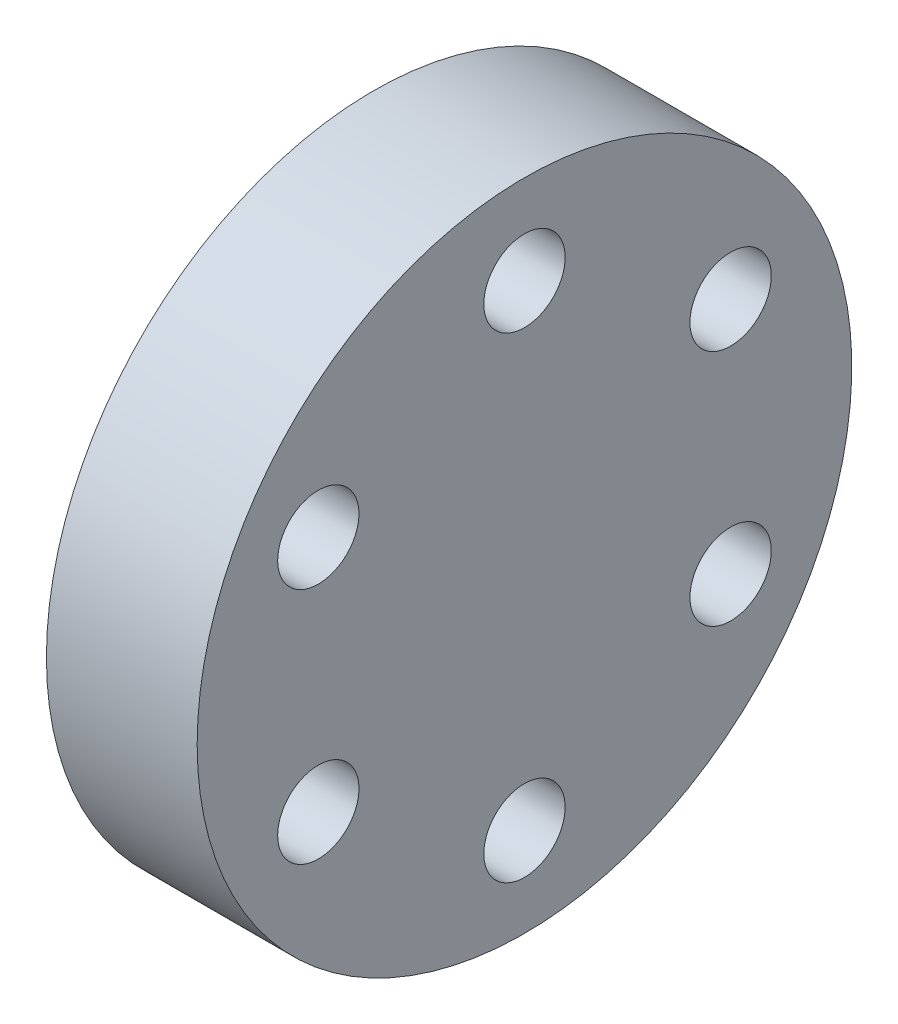
ISO-10303-21;
HEADER;
FILE_DESCRIPTION(('STEP AP214'),'2;1');
FILE_NAME('part.step','',(''),(''),'','','');
FILE_SCHEMA(('AUTOMOTIVE_DESIGN { 1 0 10303 214 1 1 1 1 }'));
ENDSEC;
DATA;
#1=APPLICATION_CONTEXT('core data for automotive mechanical design processes');
#2=APPLICATION_PROTOCOL_DEFINITION('international standard','automotive_design',2000,#1);
#3=PRODUCT_CONTEXT('',#1,'mechanical');
#4=PRODUCT('Part','Part','',(#3));
#5=PRODUCT_RELATED_PRODUCT_CATEGORY('part','',(#4));
#6=PRODUCT_DEFINITION_FORMATION('','',#4);
#7=PRODUCT_DEFINITION_CONTEXT('part definition',#1,'design');
#8=PRODUCT_DEFINITION('design','',#6,#7);
#9=PRODUCT_DEFINITION_SHAPE('','',#8);
#10=(LENGTH_UNIT() NAMED_UNIT(*) SI_UNIT(.MILLI.,.METRE.));
#11=(NAMED_UNIT(*) PLANE_ANGLE_UNIT() SI_UNIT($,.RADIAN.));
#12=(NAMED_UNIT(*) SI_UNIT($,.STERADIAN.) SOLID_ANGLE_UNIT());
#13=UNCERTAINTY_MEASURE_WITH_UNIT(LENGTH_MEASURE(1.E-05),#10,'distance_accuracy_value','');
#14=(GEOMETRIC_REPRESENTATION_CONTEXT(3) GLOBAL_UNCERTAINTY_ASSIGNED_CONTEXT((#13)) GLOBAL_UNIT_ASSIGNED_CONTEXT((#10,
#11,#12)) REPRESENTATION_CONTEXT('',''));
#15=CARTESIAN_POINT('',(0.,0.,0.));
#16=DIRECTION('',(0.,0.,1.));
#17=DIRECTION('',(1.,0.,0.));
#18=AXIS2_PLACEMENT_3D('',#15,#16,#17);
#19=CARTESIAN_POINT('',(7.6,0.,0.));
#20=DIRECTION('',(1.,0.,0.));
#21=DIRECTION('',(0.,0.,-1.));
#22=AXIS2_PLACEMENT_3D('',#19,#20,#21);
#23=PLANE('',#22);
#24=CARTESIAN_POINT('',(7.6,-6.00000000000001,10.3923048454133));
#25=DIRECTION('',(1.,0.,0.));
#26=DIRECTION('',(0.,0.,-1.));
#27=AXIS2_PLACEMENT_3D('',#24,#25,#26);
#28=CIRCLE('',#27,2.05);
#29=CARTESIAN_POINT('',(7.6,-6.00000000000001,12.4423048454133));
#30=VERTEX_POINT('',#29);
#31=EDGE_CURVE('E86',#30,#30,#28,.T.);
#32=ORIENTED_EDGE('',*,*,#31,.F.);
#33=EDGE_LOOP('',(#32));
#34=FACE_BOUND('',#33,.T.);
#35=CARTESIAN_POINT('',(7.6,-6.,-10.3923048454133));
#36=DIRECTION('',(1.,0.,0.));
#37=DIRECTION('',(0.,0.,-1.));
#38=AXIS2_PLACEMENT_3D('',#35,#36,#37);
#39=CIRCLE('',#38,2.05);
#40=CARTESIAN_POINT('',(7.6,-6.,-8.34230484541327));
#41=VERTEX_POINT('',#40);
#42=EDGE_CURVE('E71',#41,#41,#39,.T.);
#43=ORIENTED_EDGE('',*,*,#42,.F.);
#44=EDGE_LOOP('',(#43));
#45=FACE_BOUND('',#44,.T.);
#46=CARTESIAN_POINT('',(7.6,12.,0.));
#47=DIRECTION('',(1.,0.,0.));
#48=DIRECTION('',(0.,0.,-1.));
#49=AXIS2_PLACEMENT_3D('',#46,#47,#48);
#50=CIRCLE('',#49,2.05);
#51=CARTESIAN_POINT('',(7.6,12.,2.05));
#52=VERTEX_POINT('',#51);
#53=EDGE_CURVE('E57',#52,#52,#50,.T.);
#54=ORIENTED_EDGE('',*,*,#53,.F.);
#55=EDGE_LOOP('',(#54));
#56=FACE_BOUND('',#55,.T.);
#57=CARTESIAN_POINT('',(7.6,0.,0.));
#58=DIRECTION('',(1.,0.,0.));
#59=DIRECTION('',(0.,0.,-1.));
#60=AXIS2_PLACEMENT_3D('',#57,#58,#59);
#61=CIRCLE('',#60,16.5);
#62=CARTESIAN_POINT('',(7.6,0.,16.5));
#63=VERTEX_POINT('',#62);
#64=EDGE_CURVE('E10',#63,#63,#61,.T.);
#65=ORIENTED_EDGE('',*,*,#64,.T.);
#66=EDGE_LOOP('',(#65));
#67=FACE_BOUND('',#66,.T.);
#68=CARTESIAN_POINT('',(7.6,6.00000000000001,-10.3923048454133));
#69=DIRECTION('',(1.,0.,0.));
#70=DIRECTION('',(0.,0.,-1.));
#71=AXIS2_PLACEMENT_3D('',#68,#69,#70);
#72=CIRCLE('',#71,2.05);
#73=CARTESIAN_POINT('',(7.6,6.00000000000001,-8.34230484541327));
#74=VERTEX_POINT('',#73);
#75=EDGE_CURVE('E63',#74,#74,#72,.T.);
#76=ORIENTED_EDGE('',*,*,#75,.F.);
#77=EDGE_LOOP('',(#76));
#78=FACE_BOUND('',#77,.T.);
#79=CARTESIAN_POINT('',(7.6,-12.,0.));
#80=DIRECTION('',(1.,0.,0.));
#81=DIRECTION('',(0.,0.,-1.));
#82=AXIS2_PLACEMENT_3D('',#79,#80,#81);
#83=CIRCLE('',#82,2.05);
#84=CARTESIAN_POINT('',(7.6,-12.,2.05));
#85=VERTEX_POINT('',#84);
#86=EDGE_CURVE('E79',#85,#85,#83,.T.);
#87=ORIENTED_EDGE('',*,*,#86,.F.);
#88=EDGE_LOOP('',(#87));
#89=FACE_BOUND('',#88,.T.);
#90=CARTESIAN_POINT('',(7.6,5.99999999999999,10.3923048454133));
#91=DIRECTION('',(1.,0.,0.));
#92=DIRECTION('',(0.,0.,-1.));
#93=AXIS2_PLACEMENT_3D('',#90,#91,#92);
#94=CIRCLE('',#93,2.05);
#95=CARTESIAN_POINT('',(7.6,5.99999999999999,12.4423048454133));
#96=VERTEX_POINT('',#95);
#97=EDGE_CURVE('E94',#96,#96,#94,.T.);
#98=ORIENTED_EDGE('',*,*,#97,.F.);
#99=EDGE_LOOP('',(#98));
#100=FACE_BOUND('',#99,.T.);
#101=ADVANCED_FACE('F41',(#34,#45,#56,#67,#78,#89,#100),#23,.T.);
#102=CARTESIAN_POINT('',(0.,0.,0.));
#103=DIRECTION('',(1.,0.,0.));
#104=DIRECTION('',(0.,0.,-1.));
#105=AXIS2_PLACEMENT_3D('',#102,#103,#104);
#106=PLANE('',#105);
#107=CARTESIAN_POINT('',(0.,0.,0.));
#108=DIRECTION('',(-1.,0.,0.));
#109=DIRECTION('',(0.,0.,1.));
#110=AXIS2_PLACEMENT_3D('',#107,#108,#109);
#111=CIRCLE('',#110,3.225);
#112=CARTESIAN_POINT('',(0.,0.,3.225));
#113=VERTEX_POINT('',#112);
#114=EDGE_CURVE('E105',#113,#113,#111,.T.);
#115=ORIENTED_EDGE('',*,*,#114,.F.);
#116=EDGE_LOOP('',(#115));
#117=FACE_BOUND('',#116,.T.);
#118=CARTESIAN_POINT('',(0.,0.,0.));
#119=DIRECTION('',(1.,0.,0.));
#120=DIRECTION('',(0.,0.,-1.));
#121=AXIS2_PLACEMENT_3D('',#118,#119,#120);
#122=CIRCLE('',#121,16.5);
#123=CARTESIAN_POINT('',(0.,0.,16.5));
#124=VERTEX_POINT('',#123);
#125=EDGE_CURVE('E45',#124,#124,#122,.T.);
#126=ORIENTED_EDGE('',*,*,#125,.F.);
#127=EDGE_LOOP('',(#126));
#128=FACE_BOUND('',#127,.T.);
#129=CARTESIAN_POINT('',(0.,12.,0.));
#130=DIRECTION('',(1.,0.,0.));
#131=DIRECTION('',(0.,0.,-1.));
#132=AXIS2_PLACEMENT_3D('',#129,#130,#131);
#133=CIRCLE('',#132,2.05);
#134=CARTESIAN_POINT('',(0.,12.,2.05));
#135=VERTEX_POINT('',#134);
#136=EDGE_CURVE('E59',#135,#135,#133,.T.);
#137=ORIENTED_EDGE('',*,*,#136,.T.);
#138=EDGE_LOOP('',(#137));
#139=FACE_BOUND('',#138,.T.);
#140=CARTESIAN_POINT('',(0.,6.00000000000001,-10.3923048454133));
#141=DIRECTION('',(1.,0.,0.));
#142=DIRECTION('',(0.,0.,-1.));
#143=AXIS2_PLACEMENT_3D('',#140,#141,#142);
#144=CIRCLE('',#143,2.05);
#145=CARTESIAN_POINT('',(0.,6.00000000000001,-8.34230484541327));
#146=VERTEX_POINT('',#145);
#147=EDGE_CURVE('E67',#146,#146,#144,.T.);
#148=ORIENTED_EDGE('',*,*,#147,.T.);
#149=EDGE_LOOP('',(#148));
#150=FACE_BOUND('',#149,.T.);
#151=CARTESIAN_POINT('',(0.,-6.,-10.3923048454133));
#152=DIRECTION('',(1.,0.,0.));
#153=DIRECTION('',(0.,0.,-1.));
#154=AXIS2_PLACEMENT_3D('',#151,#152,#153);
#155=CIRCLE('',#154,2.05);
#156=CARTESIAN_POINT('',(0.,-6.,-8.34230484541327));
#157=VERTEX_POINT('',#156);
#158=EDGE_CURVE('E75',#157,#157,#155,.T.);
#159=ORIENTED_EDGE('',*,*,#158,.T.);
#160=EDGE_LOOP('',(#159));
#161=FACE_BOUND('',#160,.T.);
#162=CARTESIAN_POINT('',(0.,-12.,0.));
#163=DIRECTION('',(1.,0.,0.));
#164=DIRECTION('',(0.,0.,-1.));
#165=AXIS2_PLACEMENT_3D('',#162,#163,#164);
#166=CIRCLE('',#165,2.05);
#167=CARTESIAN_POINT('',(0.,-12.,2.05));
#168=VERTEX_POINT('',#167);
#169=EDGE_CURVE('E82',#168,#168,#166,.T.);
#170=ORIENTED_EDGE('',*,*,#169,.T.);
#171=EDGE_LOOP('',(#170));
#172=FACE_BOUND('',#171,.T.);
#173=CARTESIAN_POINT('',(0.,-6.00000000000001,10.3923048454133));
#174=DIRECTION('',(1.,0.,0.));
#175=DIRECTION('',(0.,0.,-1.));
#176=AXIS2_PLACEMENT_3D('',#173,#174,#175);
#177=CIRCLE('',#176,2.05);
#178=CARTESIAN_POINT('',(0.,-6.00000000000001,12.4423048454133));
#179=VERTEX_POINT('',#178);
#180=EDGE_CURVE('E90',#179,#179,#177,.T.);
#181=ORIENTED_EDGE('',*,*,#180,.T.);
#182=EDGE_LOOP('',(#181));
#183=FACE_BOUND('',#182,.T.);
#184=CARTESIAN_POINT('',(0.,5.99999999999999,10.3923048454133));
#185=DIRECTION('',(1.,0.,0.));
#186=DIRECTION('',(0.,0.,-1.));
#187=AXIS2_PLACEMENT_3D('',#184,#185,#186);
#188=CIRCLE('',#187,2.05);
#189=CARTESIAN_POINT('',(0.,5.99999999999999,12.4423048454133));
#190=VERTEX_POINT('',#189);
#191=EDGE_CURVE('E97',#190,#190,#188,.T.);
#192=ORIENTED_EDGE('',*,*,#191,.T.);
#193=EDGE_LOOP('',(#192));
#194=FACE_BOUND('',#193,.T.);
#195=ADVANCED_FACE('F123',(#117,#128,#139,#150,#161,#172,#183,#194),#106,.F.);
#196=CARTESIAN_POINT('',(7.6,0.,0.));
#197=DIRECTION('',(-1.,0.,0.));
#198=DIRECTION('',(0.,0.,1.));
#199=AXIS2_PLACEMENT_3D('',#196,#197,#198);
#200=CYLINDRICAL_SURFACE('',#199,16.5);
#201=CARTESIAN_POINT('',(7.6,0.,16.5));
#202=CARTESIAN_POINT('',(7.52083333333333,0.,16.5));
#203=CARTESIAN_POINT('',(7.44166666666667,0.,16.5));
#204=CARTESIAN_POINT('',(7.28333333333333,0.,16.5));
#205=CARTESIAN_POINT('',(7.20416666666667,0.,16.5));
#206=CARTESIAN_POINT('',(7.04583333333333,0.,16.5));
#207=CARTESIAN_POINT('',(6.96666666666667,0.,16.5));
#208=CARTESIAN_POINT('',(6.80833333333333,0.,16.5));
#209=CARTESIAN_POINT('',(6.72916666666667,0.,16.5));
#210=CARTESIAN_POINT('',(6.57083333333333,0.,16.5));
#211=CARTESIAN_POINT('',(6.49166666666667,0.,16.5));
#212=CARTESIAN_POINT('',(6.33333333333333,0.,16.5));
#213=CARTESIAN_POINT('',(6.25416666666667,0.,16.5));
#214=CARTESIAN_POINT('',(6.09583333333333,0.,16.5));
#215=CARTESIAN_POINT('',(6.01666666666667,0.,16.5));
#216=CARTESIAN_POINT('',(5.85833333333333,0.,16.5));
#217=CARTESIAN_POINT('',(5.77916666666667,0.,16.5));
#218=CARTESIAN_POINT('',(5.62083333333333,0.,16.5));
#219=CARTESIAN_POINT('',(5.54166666666667,0.,16.5));
#220=CARTESIAN_POINT('',(5.38333333333333,0.,16.5));
#221=CARTESIAN_POINT('',(5.30416666666667,0.,16.5));
#222=CARTESIAN_POINT('',(5.14583333333333,0.,16.5));
#223=CARTESIAN_POINT('',(5.06666666666667,0.,16.5));
#224=CARTESIAN_POINT('',(4.90833333333333,0.,16.5));
#225=CARTESIAN_POINT('',(4.82916666666667,0.,16.5));
#226=CARTESIAN_POINT('',(4.67083333333333,0.,16.5));
#227=CARTESIAN_POINT('',(4.59166666666667,0.,16.5));
#228=CARTESIAN_POINT('',(4.43333333333333,0.,16.5));
#229=CARTESIAN_POINT('',(4.35416666666667,0.,16.5));
#230=CARTESIAN_POINT('',(4.19583333333333,0.,16.5));
#231=CARTESIAN_POINT('',(4.11666666666667,0.,16.5));
#232=CARTESIAN_POINT('',(3.95833333333333,0.,16.5));
#233=CARTESIAN_POINT('',(3.87916666666667,0.,16.5));
#234=CARTESIAN_POINT('',(3.72083333333333,0.,16.5));
#235=CARTESIAN_POINT('',(3.64166666666667,0.,16.5));
#236=CARTESIAN_POINT('',(3.48333333333333,0.,16.5));
#237=CARTESIAN_POINT('',(3.40416666666667,0.,16.5));
#238=CARTESIAN_POINT('',(3.24583333333333,0.,16.5));
#239=CARTESIAN_POINT('',(3.16666666666667,0.,16.5));
#240=CARTESIAN_POINT('',(3.00833333333333,0.,16.5));
#241=CARTESIAN_POINT('',(2.92916666666667,0.,16.5));
#242=CARTESIAN_POINT('',(2.77083333333333,0.,16.5));
#243=CARTESIAN_POINT('',(2.69166666666667,0.,16.5));
#244=CARTESIAN_POINT('',(2.53333333333333,0.,16.5));
#245=CARTESIAN_POINT('',(2.45416666666667,0.,16.5));
#246=CARTESIAN_POINT('',(2.29583333333333,0.,16.5));
#247=CARTESIAN_POINT('',(2.21666666666667,0.,16.5));
#248=CARTESIAN_POINT('',(2.05833333333333,0.,16.5));
#249=CARTESIAN_POINT('',(1.97916666666667,0.,16.5));
#250=CARTESIAN_POINT('',(1.82083333333333,0.,16.5));
#251=CARTESIAN_POINT('',(1.74166666666667,0.,16.5));
#252=CARTESIAN_POINT('',(1.58333333333333,0.,16.5));
#253=CARTESIAN_POINT('',(1.50416666666667,0.,16.5));
#254=CARTESIAN_POINT('',(1.34583333333333,0.,16.5));
#255=CARTESIAN_POINT('',(1.26666666666667,0.,16.5));
#256=CARTESIAN_POINT('',(1.10833333333333,0.,16.5));
#257=CARTESIAN_POINT('',(1.02916666666667,0.,16.5));
#258=CARTESIAN_POINT('',(0.870833333333333,0.,16.5));
#259=CARTESIAN_POINT('',(0.791666666666667,0.,16.5));
#260=CARTESIAN_POINT('',(0.633333333333333,0.,16.5));
#261=CARTESIAN_POINT('',(0.554166666666666,0.,16.5));
#262=CARTESIAN_POINT('',(0.395833333333333,0.,16.5));
#263=CARTESIAN_POINT('',(0.316666666666667,0.,16.5));
#264=CARTESIAN_POINT('',(0.158333333333333,0.,16.5));
#265=CARTESIAN_POINT('',(0.0791666666666665,0.,16.5));
#266=CARTESIAN_POINT('',(0.,0.,16.5));
#267=B_SPLINE_CURVE_WITH_KNOTS('',3,(#201,#202,#203,#204,#205,#206,#207,#208,#209,#210,#211,
#212,#213,#214,#215,#216,#217,#218,#219,#220,#221,#222,#223,#224,#225,#226,#227,#228,#229,#230,
#231,#232,#233,#234,#235,#236,#237,#238,#239,#240,#241,#242,#243,#244,#245,#246,#247,#248,#249,
#250,#251,#252,#253,#254,#255,#256,#257,#258,#259,#260,#261,#262,#263,#264,#265,#266),
.UNSPECIFIED.,.F.,.F.,(4,2,2,2,2,2,2,2,2,2,2,2,2,2,2,2,2,2,2,2,2,2,2,2,2,2,2,2,2,2,2,2,4),(0.,
0.2375,0.475,0.7125,0.95,1.1875,1.425,1.6625,1.9,2.1375,2.375,2.6125,2.85,3.0875,3.325,3.5625,
3.8,4.0375,4.275,4.5125,4.75,4.9875,5.225,5.4625,5.7,5.9375,6.175,6.4125,6.65,6.8875,7.125,
7.3625,7.6),.UNSPECIFIED.);
#268=EDGE_CURVE('BSEAM43',#63,#124,#267,.T.);
#269=ORIENTED_EDGE('',*,*,#64,.F.);
#270=ORIENTED_EDGE('',*,*,#125,.T.);
#271=ORIENTED_EDGE('',*,*,#268,.T.);
#272=ORIENTED_EDGE('',*,*,#268,.F.);
#273=EDGE_LOOP('',(#269,#271,#270,#272));
#274=FACE_BOUND('',#273,.T.);
#275=ADVANCED_FACE('F43',(#274),#200,.T.);
#276=CARTESIAN_POINT('',(7.6,12.,0.));
#277=DIRECTION('',(-1.,0.,0.));
#278=DIRECTION('',(0.,0.,1.));
#279=AXIS2_PLACEMENT_3D('',#276,#277,#278);
#280=CYLINDRICAL_SURFACE('',#279,2.05);
#281=CARTESIAN_POINT('',(7.6,12.,2.05));
#282=CARTESIAN_POINT('',(7.52083333333333,12.,2.05));
#283=CARTESIAN_POINT('',(7.44166666666667,12.,2.05));
#284=CARTESIAN_POINT('',(7.28333333333333,12.,2.05));
#285=CARTESIAN_POINT('',(7.20416666666667,12.,2.05));
#286=CARTESIAN_POINT('',(7.04583333333333,12.,2.05));
#287=CARTESIAN_POINT('',(6.96666666666667,12.,2.05));
#288=CARTESIAN_POINT('',(6.80833333333333,12.,2.05));
#289=CARTESIAN_POINT('',(6.72916666666667,12.,2.05));
#290=CARTESIAN_POINT('',(6.57083333333333,12.,2.05));
#291=CARTESIAN_POINT('',(6.49166666666667,12.,2.05));
#292=CARTESIAN_POINT('',(6.33333333333333,12.,2.05));
#293=CARTESIAN_POINT('',(6.25416666666667,12.,2.05));
#294=CARTESIAN_POINT('',(6.09583333333333,12.,2.05));
#295=CARTESIAN_POINT('',(6.01666666666667,12.,2.05));
#296=CARTESIAN_POINT('',(5.85833333333333,12.,2.05));
#297=CARTESIAN_POINT('',(5.77916666666667,12.,2.05));
#298=CARTESIAN_POINT('',(5.62083333333333,12.,2.05));
#299=CARTESIAN_POINT('',(5.54166666666667,12.,2.05));
#300=CARTESIAN_POINT('',(5.38333333333333,12.,2.05));
#301=CARTESIAN_POINT('',(5.30416666666667,12.,2.05));
#302=CARTESIAN_POINT('',(5.14583333333333,12.,2.05));
#303=CARTESIAN_POINT('',(5.06666666666667,12.,2.05));
#304=CARTESIAN_POINT('',(4.90833333333333,12.,2.05));
#305=CARTESIAN_POINT('',(4.82916666666667,12.,2.05));
#306=CARTESIAN_POINT('',(4.67083333333333,12.,2.05));
#307=CARTESIAN_POINT('',(4.59166666666667,12.,2.05));
#308=CARTESIAN_POINT('',(4.43333333333333,12.,2.05));
#309=CARTESIAN_POINT('',(4.35416666666667,12.,2.05));
#310=CARTESIAN_POINT('',(4.19583333333333,12.,2.05));
#311=CARTESIAN_POINT('',(4.11666666666667,12.,2.05));
#312=CARTESIAN_POINT('',(3.95833333333333,12.,2.05));
#313=CARTESIAN_POINT('',(3.87916666666667,12.,2.05));
#314=CARTESIAN_POINT('',(3.72083333333333,12.,2.05));
#315=CARTESIAN_POINT('',(3.64166666666667,12.,2.05));
#316=CARTESIAN_POINT('',(3.48333333333333,12.,2.05));
#317=CARTESIAN_POINT('',(3.40416666666667,12.,2.05));
#318=CARTESIAN_POINT('',(3.24583333333333,12.,2.05));
#319=CARTESIAN_POINT('',(3.16666666666667,12.,2.05));
#320=CARTESIAN_POINT('',(3.00833333333333,12.,2.05));
#321=CARTESIAN_POINT('',(2.92916666666667,12.,2.05));
#322=CARTESIAN_POINT('',(2.77083333333333,12.,2.05));
#323=CARTESIAN_POINT('',(2.69166666666667,12.,2.05));
#324=CARTESIAN_POINT('',(2.53333333333333,12.,2.05));
#325=CARTESIAN_POINT('',(2.45416666666667,12.,2.05));
#326=CARTESIAN_POINT('',(2.29583333333333,12.,2.05));
#327=CARTESIAN_POINT('',(2.21666666666667,12.,2.05));
#328=CARTESIAN_POINT('',(2.05833333333333,12.,2.05));
#329=CARTESIAN_POINT('',(1.97916666666667,12.,2.05));
#330=CARTESIAN_POINT('',(1.82083333333333,12.,2.05));
#331=CARTESIAN_POINT('',(1.74166666666667,12.,2.05));
#332=CARTESIAN_POINT('',(1.58333333333333,12.,2.05));
#333=CARTESIAN_POINT('',(1.50416666666667,12.,2.05));
#334=CARTESIAN_POINT('',(1.34583333333333,12.,2.05));
#335=CARTESIAN_POINT('',(1.26666666666667,12.,2.05));
#336=CARTESIAN_POINT('',(1.10833333333333,12.,2.05));
#337=CARTESIAN_POINT('',(1.02916666666667,12.,2.05));
#338=CARTESIAN_POINT('',(0.870833333333334,12.,2.05));
#339=CARTESIAN_POINT('',(0.791666666666667,12.,2.05));
#340=CARTESIAN_POINT('',(0.633333333333334,12.,2.05));
#341=CARTESIAN_POINT('',(0.554166666666667,12.,2.05));
#342=CARTESIAN_POINT('',(0.395833333333333,12.,2.05));
#343=CARTESIAN_POINT('',(0.316666666666666,12.,2.05));
#344=CARTESIAN_POINT('',(0.158333333333333,12.,2.05));
#345=CARTESIAN_POINT('',(0.0791666666666666,12.,2.05));
#346=CARTESIAN_POINT('',(0.,12.,2.05));
#347=B_SPLINE_CURVE_WITH_KNOTS('',3,(#281,#282,#283,#284,#285,#286,#287,#288,#289,#290,#291,
#292,#293,#294,#295,#296,#297,#298,#299,#300,#301,#302,#303,#304,#305,#306,#307,#308,#309,#310,
#311,#312,#313,#314,#315,#316,#317,#318,#319,#320,#321,#322,#323,#324,#325,#326,#327,#328,#329,
#330,#331,#332,#333,#334,#335,#336,#337,#338,#339,#340,#341,#342,#343,#344,#345,#346),
.UNSPECIFIED.,.F.,.F.,(4,2,2,2,2,2,2,2,2,2,2,2,2,2,2,2,2,2,2,2,2,2,2,2,2,2,2,2,2,2,2,2,4),(0.,
0.237500000000001,0.475000000000001,0.7125,0.95,1.1875,1.425,1.6625,1.9,2.1375,2.375,2.6125,
2.85,3.0875,3.325,3.5625,3.8,4.0375,4.275,4.5125,4.75,4.9875,5.225,5.4625,5.7,5.9375,6.175,
6.4125,6.65,6.8875,7.125,7.3625,7.6),.UNSPECIFIED.);
#348=EDGE_CURVE('BSEAM158',#52,#135,#347,.T.);
#349=ORIENTED_EDGE('',*,*,#53,.T.);
#350=ORIENTED_EDGE('',*,*,#136,.F.);
#351=ORIENTED_EDGE('',*,*,#348,.T.);
#352=ORIENTED_EDGE('',*,*,#348,.F.);
#353=EDGE_LOOP('',(#349,#351,#350,#352));
#354=FACE_BOUND('',#353,.T.);
#355=ADVANCED_FACE('F158',(#354),#280,.F.);
#356=CARTESIAN_POINT('',(7.6,6.00000000000001,-10.3923048454133));
#357=DIRECTION('',(-1.,0.,0.));
#358=DIRECTION('',(0.,0.,1.));
#359=AXIS2_PLACEMENT_3D('',#356,#357,#358);
#360=CYLINDRICAL_SURFACE('',#359,2.05);
#361=CARTESIAN_POINT('',(7.6,6.00000000000001,-8.34230484541327));
#362=CARTESIAN_POINT('',(7.52083333333333,6.00000000000001,-8.34230484541327));
#363=CARTESIAN_POINT('',(7.44166666666667,6.00000000000001,-8.34230484541327));
#364=CARTESIAN_POINT('',(7.28333333333333,6.00000000000001,-8.34230484541327));
#365=CARTESIAN_POINT('',(7.20416666666667,6.00000000000001,-8.34230484541327));
#366=CARTESIAN_POINT('',(7.04583333333333,6.00000000000001,-8.34230484541327));
#367=CARTESIAN_POINT('',(6.96666666666667,6.00000000000001,-8.34230484541327));
#368=CARTESIAN_POINT('',(6.80833333333333,6.00000000000001,-8.34230484541327));
#369=CARTESIAN_POINT('',(6.72916666666667,6.00000000000001,-8.34230484541327));
#370=CARTESIAN_POINT('',(6.57083333333333,6.00000000000001,-8.34230484541327));
#371=CARTESIAN_POINT('',(6.49166666666667,6.00000000000001,-8.34230484541327));
#372=CARTESIAN_POINT('',(6.33333333333333,6.00000000000001,-8.34230484541327));
#373=CARTESIAN_POINT('',(6.25416666666667,6.00000000000001,-8.34230484541327));
#374=CARTESIAN_POINT('',(6.09583333333333,6.00000000000001,-8.34230484541327));
#375=CARTESIAN_POINT('',(6.01666666666667,6.00000000000001,-8.34230484541327));
#376=CARTESIAN_POINT('',(5.85833333333333,6.00000000000001,-8.34230484541327));
#377=CARTESIAN_POINT('',(5.77916666666667,6.00000000000001,-8.34230484541327));
#378=CARTESIAN_POINT('',(5.62083333333333,6.00000000000001,-8.34230484541327));
#379=CARTESIAN_POINT('',(5.54166666666667,6.00000000000001,-8.34230484541327));
#380=CARTESIAN_POINT('',(5.38333333333333,6.00000000000001,-8.34230484541327));
#381=CARTESIAN_POINT('',(5.30416666666667,6.00000000000001,-8.34230484541327));
#382=CARTESIAN_POINT('',(5.14583333333333,6.00000000000001,-8.34230484541327));
#383=CARTESIAN_POINT('',(5.06666666666667,6.00000000000001,-8.34230484541327));
#384=CARTESIAN_POINT('',(4.90833333333333,6.00000000000001,-8.34230484541327));
#385=CARTESIAN_POINT('',(4.82916666666667,6.00000000000001,-8.34230484541327));
#386=CARTESIAN_POINT('',(4.67083333333333,6.00000000000001,-8.34230484541327));
#387=CARTESIAN_POINT('',(4.59166666666667,6.00000000000001,-8.34230484541327));
#388=CARTESIAN_POINT('',(4.43333333333333,6.00000000000001,-8.34230484541327));
#389=CARTESIAN_POINT('',(4.35416666666667,6.00000000000001,-8.34230484541327));
#390=CARTESIAN_POINT('',(4.19583333333333,6.00000000000001,-8.34230484541327));
#391=CARTESIAN_POINT('',(4.11666666666667,6.00000000000001,-8.34230484541327));
#392=CARTESIAN_POINT('',(3.95833333333333,6.00000000000001,-8.34230484541327));
#393=CARTESIAN_POINT('',(3.87916666666667,6.00000000000001,-8.34230484541327));
#394=CARTESIAN_POINT('',(3.72083333333333,6.00000000000001,-8.34230484541327));
#395=CARTESIAN_POINT('',(3.64166666666667,6.00000000000001,-8.34230484541327));
#396=CARTESIAN_POINT('',(3.48333333333333,6.00000000000001,-8.34230484541327));
#397=CARTESIAN_POINT('',(3.40416666666667,6.00000000000001,-8.34230484541327));
#398=CARTESIAN_POINT('',(3.24583333333333,6.00000000000001,-8.34230484541327));
#399=CARTESIAN_POINT('',(3.16666666666667,6.00000000000001,-8.34230484541327));
#400=CARTESIAN_POINT('',(3.00833333333333,6.00000000000001,-8.34230484541327));
#401=CARTESIAN_POINT('',(2.92916666666667,6.00000000000001,-8.34230484541327));
#402=CARTESIAN_POINT('',(2.77083333333333,6.00000000000001,-8.34230484541327));
#403=CARTESIAN_POINT('',(2.69166666666667,6.00000000000001,-8.34230484541327));
#404=CARTESIAN_POINT('',(2.53333333333333,6.00000000000001,-8.34230484541327));
#405=CARTESIAN_POINT('',(2.45416666666667,6.00000000000001,-8.34230484541327));
#406=CARTESIAN_POINT('',(2.29583333333333,6.00000000000001,-8.34230484541327));
#407=CARTESIAN_POINT('',(2.21666666666667,6.00000000000001,-8.34230484541327));
#408=CARTESIAN_POINT('',(2.05833333333333,6.00000000000001,-8.34230484541327));
#409=CARTESIAN_POINT('',(1.97916666666667,6.00000000000001,-8.34230484541327));
#410=CARTESIAN_POINT('',(1.82083333333333,6.00000000000001,-8.34230484541327));
#411=CARTESIAN_POINT('',(1.74166666666667,6.00000000000001,-8.34230484541327));
#412=CARTESIAN_POINT('',(1.58333333333333,6.00000000000001,-8.34230484541327));
#413=CARTESIAN_POINT('',(1.50416666666667,6.00000000000001,-8.34230484541327));
#414=CARTESIAN_POINT('',(1.34583333333333,6.00000000000001,-8.34230484541327));
#415=CARTESIAN_POINT('',(1.26666666666667,6.00000000000001,-8.34230484541327));
#416=CARTESIAN_POINT('',(1.10833333333333,6.00000000000001,-8.34230484541327));
#417=CARTESIAN_POINT('',(1.02916666666667,6.00000000000001,-8.34230484541327));
#418=CARTESIAN_POINT('',(0.870833333333334,6.00000000000001,-8.34230484541327));
#419=CARTESIAN_POINT('',(0.791666666666667,6.00000000000001,-8.34230484541327));
#420=CARTESIAN_POINT('',(0.633333333333334,6.00000000000001,-8.34230484541327));
#421=CARTESIAN_POINT('',(0.554166666666667,6.00000000000001,-8.34230484541327));
#422=CARTESIAN_POINT('',(0.395833333333333,6.00000000000001,-8.34230484541327));
#423=CARTESIAN_POINT('',(0.316666666666666,6.00000000000001,-8.34230484541327));
#424=CARTESIAN_POINT('',(0.158333333333333,6.00000000000001,-8.34230484541327));
#425=CARTESIAN_POINT('',(0.0791666666666666,6.00000000000001,-8.34230484541327));
#426=CARTESIAN_POINT('',(0.,6.00000000000001,-8.34230484541327));
#427=B_SPLINE_CURVE_WITH_KNOTS('',3,(#361,#362,#363,#364,#365,#366,#367,#368,#369,#370,#371,
#372,#373,#374,#375,#376,#377,#378,#379,#380,#381,#382,#383,#384,#385,#386,#387,#388,#389,#390,
#391,#392,#393,#394,#395,#396,#397,#398,#399,#400,#401,#402,#403,#404,#405,#406,#407,#408,#409,
#410,#411,#412,#413,#414,#415,#416,#417,#418,#419,#420,#421,#422,#423,#424,#425,#426),
.UNSPECIFIED.,.F.,.F.,(4,2,2,2,2,2,2,2,2,2,2,2,2,2,2,2,2,2,2,2,2,2,2,2,2,2,2,2,2,2,2,2,4),(0.,
0.237500000000001,0.475000000000001,0.7125,0.95,1.1875,1.425,1.6625,1.9,2.1375,2.375,2.6125,
2.85,3.0875,3.325,3.5625,3.8,4.0375,4.275,4.5125,4.75,4.9875,5.225,5.4625,5.7,5.9375,6.175,
6.4125,6.65,6.8875,7.125,7.3625,7.6),.UNSPECIFIED.);
#428=EDGE_CURVE('BSEAM161',#74,#146,#427,.T.);
#429=ORIENTED_EDGE('',*,*,#75,.T.);
#430=ORIENTED_EDGE('',*,*,#147,.F.);
#431=ORIENTED_EDGE('',*,*,#428,.T.);
#432=ORIENTED_EDGE('',*,*,#428,.F.);
#433=EDGE_LOOP('',(#429,#431,#430,#432));
#434=FACE_BOUND('',#433,.T.);
#435=ADVANCED_FACE('F161',(#434),#360,.F.);
#436=CARTESIAN_POINT('',(7.6,-6.,-10.3923048454133));
#437=DIRECTION('',(-1.,0.,0.));
#438=DIRECTION('',(0.,0.,1.));
#439=AXIS2_PLACEMENT_3D('',#436,#437,#438);
#440=CYLINDRICAL_SURFACE('',#439,2.05);
#441=CARTESIAN_POINT('',(7.6,-6.,-8.34230484541327));
#442=CARTESIAN_POINT('',(7.52083333333333,-6.,-8.34230484541327));
#443=CARTESIAN_POINT('',(7.44166666666667,-6.,-8.34230484541327));
#444=CARTESIAN_POINT('',(7.28333333333333,-6.,-8.34230484541327));
#445=CARTESIAN_POINT('',(7.20416666666667,-6.,-8.34230484541327));
#446=CARTESIAN_POINT('',(7.04583333333333,-6.,-8.34230484541327));
#447=CARTESIAN_POINT('',(6.96666666666667,-6.,-8.34230484541327));
#448=CARTESIAN_POINT('',(6.80833333333333,-6.,-8.34230484541327));
#449=CARTESIAN_POINT('',(6.72916666666667,-6.,-8.34230484541327));
#450=CARTESIAN_POINT('',(6.57083333333333,-6.,-8.34230484541327));
#451=CARTESIAN_POINT('',(6.49166666666667,-6.,-8.34230484541327));
#452=CARTESIAN_POINT('',(6.33333333333333,-6.,-8.34230484541327));
#453=CARTESIAN_POINT('',(6.25416666666667,-6.,-8.34230484541327));
#454=CARTESIAN_POINT('',(6.09583333333333,-6.,-8.34230484541327));
#455=CARTESIAN_POINT('',(6.01666666666667,-6.,-8.34230484541327));
#456=CARTESIAN_POINT('',(5.85833333333333,-6.,-8.34230484541327));
#457=CARTESIAN_POINT('',(5.77916666666667,-6.,-8.34230484541327));
#458=CARTESIAN_POINT('',(5.62083333333333,-6.,-8.34230484541327));
#459=CARTESIAN_POINT('',(5.54166666666667,-6.,-8.34230484541327));
#460=CARTESIAN_POINT('',(5.38333333333333,-6.,-8.34230484541327));
#461=CARTESIAN_POINT('',(5.30416666666667,-6.,-8.34230484541327));
#462=CARTESIAN_POINT('',(5.14583333333333,-6.,-8.34230484541327));
#463=CARTESIAN_POINT('',(5.06666666666667,-6.,-8.34230484541327));
#464=CARTESIAN_POINT('',(4.90833333333333,-6.,-8.34230484541327));
#465=CARTESIAN_POINT('',(4.82916666666667,-6.,-8.34230484541327));
#466=CARTESIAN_POINT('',(4.67083333333333,-6.,-8.34230484541327));
#467=CARTESIAN_POINT('',(4.59166666666667,-6.,-8.34230484541327));
#468=CARTESIAN_POINT('',(4.43333333333333,-6.,-8.34230484541327));
#469=CARTESIAN_POINT('',(4.35416666666667,-6.,-8.34230484541327));
#470=CARTESIAN_POINT('',(4.19583333333333,-6.,-8.34230484541327));
#471=CARTESIAN_POINT('',(4.11666666666667,-6.,-8.34230484541327));
#472=CARTESIAN_POINT('',(3.95833333333333,-6.,-8.34230484541327));
#473=CARTESIAN_POINT('',(3.87916666666667,-6.,-8.34230484541327));
#474=CARTESIAN_POINT('',(3.72083333333333,-6.,-8.34230484541327));
#475=CARTESIAN_POINT('',(3.64166666666667,-6.,-8.34230484541327));
#476=CARTESIAN_POINT('',(3.48333333333333,-6.,-8.34230484541327));
#477=CARTESIAN_POINT('',(3.40416666666667,-6.,-8.34230484541327));
#478=CARTESIAN_POINT('',(3.24583333333333,-6.,-8.34230484541327));
#479=CARTESIAN_POINT('',(3.16666666666667,-6.,-8.34230484541327));
#480=CARTESIAN_POINT('',(3.00833333333333,-6.,-8.34230484541327));
#481=CARTESIAN_POINT('',(2.92916666666667,-6.,-8.34230484541327));
#482=CARTESIAN_POINT('',(2.77083333333333,-6.,-8.34230484541327));
#483=CARTESIAN_POINT('',(2.69166666666667,-6.,-8.34230484541327));
#484=CARTESIAN_POINT('',(2.53333333333333,-6.,-8.34230484541327));
#485=CARTESIAN_POINT('',(2.45416666666667,-6.,-8.34230484541327));
#486=CARTESIAN_POINT('',(2.29583333333333,-6.,-8.34230484541327));
#487=CARTESIAN_POINT('',(2.21666666666667,-6.,-8.34230484541327));
#488=CARTESIAN_POINT('',(2.05833333333333,-6.,-8.34230484541327));
#489=CARTESIAN_POINT('',(1.97916666666667,-6.,-8.34230484541327));
#490=CARTESIAN_POINT('',(1.82083333333333,-6.,-8.34230484541327));
#491=CARTESIAN_POINT('',(1.74166666666667,-6.,-8.34230484541327));
#492=CARTESIAN_POINT('',(1.58333333333333,-6.,-8.34230484541327));
#493=CARTESIAN_POINT('',(1.50416666666667,-6.,-8.34230484541327));
#494=CARTESIAN_POINT('',(1.34583333333333,-6.,-8.34230484541327));
#495=CARTESIAN_POINT('',(1.26666666666667,-6.,-8.34230484541327));
#496=CARTESIAN_POINT('',(1.10833333333333,-6.,-8.34230484541327));
#497=CARTESIAN_POINT('',(1.02916666666667,-6.,-8.34230484541327));
#498=CARTESIAN_POINT('',(0.870833333333334,-6.,-8.34230484541327));
#499=CARTESIAN_POINT('',(0.791666666666667,-6.,-8.34230484541327));
#500=CARTESIAN_POINT('',(0.633333333333334,-6.,-8.34230484541327));
#501=CARTESIAN_POINT('',(0.554166666666667,-6.,-8.34230484541327));
#502=CARTESIAN_POINT('',(0.395833333333333,-6.,-8.34230484541327));
#503=CARTESIAN_POINT('',(0.316666666666666,-6.,-8.34230484541327));
#504=CARTESIAN_POINT('',(0.158333333333333,-6.,-8.34230484541327));
#505=CARTESIAN_POINT('',(0.0791666666666666,-6.,-8.34230484541327));
#506=CARTESIAN_POINT('',(0.,-6.,-8.34230484541327));
#507=B_SPLINE_CURVE_WITH_KNOTS('',3,(#441,#442,#443,#444,#445,#446,#447,#448,#449,#450,#451,
#452,#453,#454,#455,#456,#457,#458,#459,#460,#461,#462,#463,#464,#465,#466,#467,#468,#469,#470,
#471,#472,#473,#474,#475,#476,#477,#478,#479,#480,#481,#482,#483,#484,#485,#486,#487,#488,#489,
#490,#491,#492,#493,#494,#495,#496,#497,#498,#499,#500,#501,#502,#503,#504,#505,#506),
.UNSPECIFIED.,.F.,.F.,(4,2,2,2,2,2,2,2,2,2,2,2,2,2,2,2,2,2,2,2,2,2,2,2,2,2,2,2,2,2,2,2,4),(0.,
0.237500000000001,0.475000000000001,0.7125,0.95,1.1875,1.425,1.6625,1.9,2.1375,2.375,2.6125,
2.85,3.0875,3.325,3.5625,3.8,4.0375,4.275,4.5125,4.75,4.9875,5.225,5.4625,5.7,5.9375,6.175,
6.4125,6.65,6.8875,7.125,7.3625,7.6),.UNSPECIFIED.);
#508=EDGE_CURVE('BSEAM165',#41,#157,#507,.T.);
#509=ORIENTED_EDGE('',*,*,#42,.T.);
#510=ORIENTED_EDGE('',*,*,#158,.F.);
#511=ORIENTED_EDGE('',*,*,#508,.T.);
#512=ORIENTED_EDGE('',*,*,#508,.F.);
#513=EDGE_LOOP('',(#509,#511,#510,#512));
#514=FACE_BOUND('',#513,.T.);
#515=ADVANCED_FACE('F165',(#514),#440,.F.);
#516=CARTESIAN_POINT('',(7.6,-12.,0.));
#517=DIRECTION('',(-1.,0.,0.));
#518=DIRECTION('',(0.,0.,1.));
#519=AXIS2_PLACEMENT_3D('',#516,#517,#518);
#520=CYLINDRICAL_SURFACE('',#519,2.05);
#521=CARTESIAN_POINT('',(7.6,-12.,2.05));
#522=CARTESIAN_POINT('',(7.52083333333333,-12.,2.05));
#523=CARTESIAN_POINT('',(7.44166666666667,-12.,2.05));
#524=CARTESIAN_POINT('',(7.28333333333333,-12.,2.05));
#525=CARTESIAN_POINT('',(7.20416666666667,-12.,2.05));
#526=CARTESIAN_POINT('',(7.04583333333333,-12.,2.05));
#527=CARTESIAN_POINT('',(6.96666666666667,-12.,2.05));
#528=CARTESIAN_POINT('',(6.80833333333333,-12.,2.05));
#529=CARTESIAN_POINT('',(6.72916666666667,-12.,2.05));
#530=CARTESIAN_POINT('',(6.57083333333333,-12.,2.05));
#531=CARTESIAN_POINT('',(6.49166666666667,-12.,2.05));
#532=CARTESIAN_POINT('',(6.33333333333333,-12.,2.05));
#533=CARTESIAN_POINT('',(6.25416666666667,-12.,2.05));
#534=CARTESIAN_POINT('',(6.09583333333333,-12.,2.05));
#535=CARTESIAN_POINT('',(6.01666666666667,-12.,2.05));
#536=CARTESIAN_POINT('',(5.85833333333333,-12.,2.05));
#537=CARTESIAN_POINT('',(5.77916666666667,-12.,2.05));
#538=CARTESIAN_POINT('',(5.62083333333333,-12.,2.05));
#539=CARTESIAN_POINT('',(5.54166666666667,-12.,2.05));
#540=CARTESIAN_POINT('',(5.38333333333333,-12.,2.05));
#541=CARTESIAN_POINT('',(5.30416666666667,-12.,2.05));
#542=CARTESIAN_POINT('',(5.14583333333333,-12.,2.05));
#543=CARTESIAN_POINT('',(5.06666666666667,-12.,2.05));
#544=CARTESIAN_POINT('',(4.90833333333333,-12.,2.05));
#545=CARTESIAN_POINT('',(4.82916666666667,-12.,2.05));
#546=CARTESIAN_POINT('',(4.67083333333333,-12.,2.05));
#547=CARTESIAN_POINT('',(4.59166666666667,-12.,2.05));
#548=CARTESIAN_POINT('',(4.43333333333333,-12.,2.05));
#549=CARTESIAN_POINT('',(4.35416666666667,-12.,2.05));
#550=CARTESIAN_POINT('',(4.19583333333333,-12.,2.05));
#551=CARTESIAN_POINT('',(4.11666666666667,-12.,2.05));
#552=CARTESIAN_POINT('',(3.95833333333333,-12.,2.05));
#553=CARTESIAN_POINT('',(3.87916666666667,-12.,2.05));
#554=CARTESIAN_POINT('',(3.72083333333333,-12.,2.05));
#555=CARTESIAN_POINT('',(3.64166666666667,-12.,2.05));
#556=CARTESIAN_POINT('',(3.48333333333333,-12.,2.05));
#557=CARTESIAN_POINT('',(3.40416666666667,-12.,2.05));
#558=CARTESIAN_POINT('',(3.24583333333333,-12.,2.05));
#559=CARTESIAN_POINT('',(3.16666666666667,-12.,2.05));
#560=CARTESIAN_POINT('',(3.00833333333333,-12.,2.05));
#561=CARTESIAN_POINT('',(2.92916666666667,-12.,2.05));
#562=CARTESIAN_POINT('',(2.77083333333333,-12.,2.05));
#563=CARTESIAN_POINT('',(2.69166666666667,-12.,2.05));
#564=CARTESIAN_POINT('',(2.53333333333333,-12.,2.05));
#565=CARTESIAN_POINT('',(2.45416666666667,-12.,2.05));
#566=CARTESIAN_POINT('',(2.29583333333333,-12.,2.05));
#567=CARTESIAN_POINT('',(2.21666666666667,-12.,2.05));
#568=CARTESIAN_POINT('',(2.05833333333333,-12.,2.05));
#569=CARTESIAN_POINT('',(1.97916666666667,-12.,2.05));
#570=CARTESIAN_POINT('',(1.82083333333333,-12.,2.05));
#571=CARTESIAN_POINT('',(1.74166666666667,-12.,2.05));
#572=CARTESIAN_POINT('',(1.58333333333333,-12.,2.05));
#573=CARTESIAN_POINT('',(1.50416666666667,-12.,2.05));
#574=CARTESIAN_POINT('',(1.34583333333333,-12.,2.05));
#575=CARTESIAN_POINT('',(1.26666666666667,-12.,2.05));
#576=CARTESIAN_POINT('',(1.10833333333333,-12.,2.05));
#577=CARTESIAN_POINT('',(1.02916666666667,-12.,2.05));
#578=CARTESIAN_POINT('',(0.870833333333334,-12.,2.05));
#579=CARTESIAN_POINT('',(0.791666666666667,-12.,2.05));
#580=CARTESIAN_POINT('',(0.633333333333334,-12.,2.05));
#581=CARTESIAN_POINT('',(0.554166666666667,-12.,2.05));
#582=CARTESIAN_POINT('',(0.395833333333333,-12.,2.05));
#583=CARTESIAN_POINT('',(0.316666666666666,-12.,2.05));
#584=CARTESIAN_POINT('',(0.158333333333333,-12.,2.05));
#585=CARTESIAN_POINT('',(0.0791666666666666,-12.,2.05));
#586=CARTESIAN_POINT('',(0.,-12.,2.05));
#587=B_SPLINE_CURVE_WITH_KNOTS('',3,(#521,#522,#523,#524,#525,#526,#527,#528,#529,#530,#531,
#532,#533,#534,#535,#536,#537,#538,#539,#540,#541,#542,#543,#544,#545,#546,#547,#548,#549,#550,
#551,#552,#553,#554,#555,#556,#557,#558,#559,#560,#561,#562,#563,#564,#565,#566,#567,#568,#569,
#570,#571,#572,#573,#574,#575,#576,#577,#578,#579,#580,#581,#582,#583,#584,#585,#586),
.UNSPECIFIED.,.F.,.F.,(4,2,2,2,2,2,2,2,2,2,2,2,2,2,2,2,2,2,2,2,2,2,2,2,2,2,2,2,2,2,2,2,4),(0.,
0.237500000000001,0.475000000000001,0.7125,0.95,1.1875,1.425,1.6625,1.9,2.1375,2.375,2.6125,
2.85,3.0875,3.325,3.5625,3.8,4.0375,4.275,4.5125,4.75,4.9875,5.225,5.4625,5.7,5.9375,6.175,
6.4125,6.65,6.8875,7.125,7.3625,7.6),.UNSPECIFIED.);
#588=EDGE_CURVE('BSEAM147',#85,#168,#587,.T.);
#589=ORIENTED_EDGE('',*,*,#86,.T.);
#590=ORIENTED_EDGE('',*,*,#169,.F.);
#591=ORIENTED_EDGE('',*,*,#588,.T.);
#592=ORIENTED_EDGE('',*,*,#588,.F.);
#593=EDGE_LOOP('',(#589,#591,#590,#592));
#594=FACE_BOUND('',#593,.T.);
#595=ADVANCED_FACE('F147',(#594),#520,.F.);
#596=CARTESIAN_POINT('',(7.6,-6.00000000000001,10.3923048454133));
#597=DIRECTION('',(-1.,0.,0.));
#598=DIRECTION('',(0.,0.,1.));
#599=AXIS2_PLACEMENT_3D('',#596,#597,#598);
#600=CYLINDRICAL_SURFACE('',#599,2.05);
#601=CARTESIAN_POINT('',(7.6,-6.00000000000001,12.4423048454133));
#602=CARTESIAN_POINT('',(7.52083333333333,-6.00000000000001,12.4423048454133));
#603=CARTESIAN_POINT('',(7.44166666666667,-6.00000000000001,12.4423048454133));
#604=CARTESIAN_POINT('',(7.28333333333333,-6.00000000000001,12.4423048454133));
#605=CARTESIAN_POINT('',(7.20416666666667,-6.00000000000001,12.4423048454133));
#606=CARTESIAN_POINT('',(7.04583333333333,-6.00000000000001,12.4423048454133));
#607=CARTESIAN_POINT('',(6.96666666666667,-6.00000000000001,12.4423048454133));
#608=CARTESIAN_POINT('',(6.80833333333333,-6.00000000000001,12.4423048454133));
#609=CARTESIAN_POINT('',(6.72916666666667,-6.00000000000001,12.4423048454133));
#610=CARTESIAN_POINT('',(6.57083333333333,-6.00000000000001,12.4423048454133));
#611=CARTESIAN_POINT('',(6.49166666666667,-6.00000000000001,12.4423048454133));
#612=CARTESIAN_POINT('',(6.33333333333333,-6.00000000000001,12.4423048454133));
#613=CARTESIAN_POINT('',(6.25416666666667,-6.00000000000001,12.4423048454133));
#614=CARTESIAN_POINT('',(6.09583333333333,-6.00000000000001,12.4423048454133));
#615=CARTESIAN_POINT('',(6.01666666666667,-6.00000000000001,12.4423048454133));
#616=CARTESIAN_POINT('',(5.85833333333333,-6.00000000000001,12.4423048454133));
#617=CARTESIAN_POINT('',(5.77916666666667,-6.00000000000001,12.4423048454133));
#618=CARTESIAN_POINT('',(5.62083333333333,-6.00000000000001,12.4423048454133));
#619=CARTESIAN_POINT('',(5.54166666666667,-6.00000000000001,12.4423048454133));
#620=CARTESIAN_POINT('',(5.38333333333333,-6.00000000000001,12.4423048454133));
#621=CARTESIAN_POINT('',(5.30416666666667,-6.00000000000001,12.4423048454133));
#622=CARTESIAN_POINT('',(5.14583333333333,-6.00000000000001,12.4423048454133));
#623=CARTESIAN_POINT('',(5.06666666666667,-6.00000000000001,12.4423048454133));
#624=CARTESIAN_POINT('',(4.90833333333333,-6.00000000000001,12.4423048454133));
#625=CARTESIAN_POINT('',(4.82916666666667,-6.00000000000001,12.4423048454133));
#626=CARTESIAN_POINT('',(4.67083333333333,-6.00000000000001,12.4423048454133));
#627=CARTESIAN_POINT('',(4.59166666666667,-6.00000000000001,12.4423048454133));
#628=CARTESIAN_POINT('',(4.43333333333333,-6.00000000000001,12.4423048454133));
#629=CARTESIAN_POINT('',(4.35416666666667,-6.00000000000001,12.4423048454133));
#630=CARTESIAN_POINT('',(4.19583333333333,-6.00000000000001,12.4423048454133));
#631=CARTESIAN_POINT('',(4.11666666666667,-6.00000000000001,12.4423048454133));
#632=CARTESIAN_POINT('',(3.95833333333333,-6.00000000000001,12.4423048454133));
#633=CARTESIAN_POINT('',(3.87916666666667,-6.00000000000001,12.4423048454133));
#634=CARTESIAN_POINT('',(3.72083333333333,-6.00000000000001,12.4423048454133));
#635=CARTESIAN_POINT('',(3.64166666666667,-6.00000000000001,12.4423048454133));
#636=CARTESIAN_POINT('',(3.48333333333333,-6.00000000000001,12.4423048454133));
#637=CARTESIAN_POINT('',(3.40416666666667,-6.00000000000001,12.4423048454133));
#638=CARTESIAN_POINT('',(3.24583333333333,-6.00000000000001,12.4423048454133));
#639=CARTESIAN_POINT('',(3.16666666666667,-6.00000000000001,12.4423048454133));
#640=CARTESIAN_POINT('',(3.00833333333333,-6.00000000000001,12.4423048454133));
#641=CARTESIAN_POINT('',(2.92916666666667,-6.00000000000001,12.4423048454133));
#642=CARTESIAN_POINT('',(2.77083333333333,-6.00000000000001,12.4423048454133));
#643=CARTESIAN_POINT('',(2.69166666666667,-6.00000000000001,12.4423048454133));
#644=CARTESIAN_POINT('',(2.53333333333333,-6.00000000000001,12.4423048454133));
#645=CARTESIAN_POINT('',(2.45416666666667,-6.00000000000001,12.4423048454133));
#646=CARTESIAN_POINT('',(2.29583333333333,-6.00000000000001,12.4423048454133));
#647=CARTESIAN_POINT('',(2.21666666666667,-6.00000000000001,12.4423048454133));
#648=CARTESIAN_POINT('',(2.05833333333333,-6.00000000000001,12.4423048454133));
#649=CARTESIAN_POINT('',(1.97916666666667,-6.00000000000001,12.4423048454133));
#650=CARTESIAN_POINT('',(1.82083333333333,-6.00000000000001,12.4423048454133));
#651=CARTESIAN_POINT('',(1.74166666666667,-6.00000000000001,12.4423048454133));
#652=CARTESIAN_POINT('',(1.58333333333333,-6.00000000000001,12.4423048454133));
#653=CARTESIAN_POINT('',(1.50416666666667,-6.00000000000001,12.4423048454133));
#654=CARTESIAN_POINT('',(1.34583333333333,-6.00000000000001,12.4423048454133));
#655=CARTESIAN_POINT('',(1.26666666666667,-6.00000000000001,12.4423048454133));
#656=CARTESIAN_POINT('',(1.10833333333333,-6.00000000000001,12.4423048454133));
#657=CARTESIAN_POINT('',(1.02916666666667,-6.00000000000001,12.4423048454133));
#658=CARTESIAN_POINT('',(0.870833333333334,-6.00000000000001,12.4423048454133));
#659=CARTESIAN_POINT('',(0.791666666666667,-6.00000000000001,12.4423048454133));
#660=CARTESIAN_POINT('',(0.633333333333334,-6.00000000000001,12.4423048454133));
#661=CARTESIAN_POINT('',(0.554166666666667,-6.00000000000001,12.4423048454133));
#662=CARTESIAN_POINT('',(0.395833333333333,-6.00000000000001,12.4423048454133));
#663=CARTESIAN_POINT('',(0.316666666666666,-6.00000000000001,12.4423048454133));
#664=CARTESIAN_POINT('',(0.158333333333333,-6.00000000000001,12.4423048454133));
#665=CARTESIAN_POINT('',(0.0791666666666666,-6.00000000000001,12.4423048454133));
#666=CARTESIAN_POINT('',(0.,-6.00000000000001,12.4423048454133));
#667=B_SPLINE_CURVE_WITH_KNOTS('',3,(#601,#602,#603,#604,#605,#606,#607,#608,#609,#610,#611,
#612,#613,#614,#615,#616,#617,#618,#619,#620,#621,#622,#623,#624,#625,#626,#627,#628,#629,#630,
#631,#632,#633,#634,#635,#636,#637,#638,#639,#640,#641,#642,#643,#644,#645,#646,#647,#648,#649,
#650,#651,#652,#653,#654,#655,#656,#657,#658,#659,#660,#661,#662,#663,#664,#665,#666),
.UNSPECIFIED.,.F.,.F.,(4,2,2,2,2,2,2,2,2,2,2,2,2,2,2,2,2,2,2,2,2,2,2,2,2,2,2,2,2,2,2,2,4),(0.,
0.237500000000001,0.475000000000001,0.7125,0.95,1.1875,1.425,1.6625,1.9,2.1375,2.375,2.6125,
2.85,3.0875,3.325,3.5625,3.8,4.0375,4.275,4.5125,4.75,4.9875,5.225,5.4625,5.7,5.9375,6.175,
6.4125,6.65,6.8875,7.125,7.3625,7.6),.UNSPECIFIED.);
#668=EDGE_CURVE('BSEAM141',#30,#179,#667,.T.);
#669=ORIENTED_EDGE('',*,*,#31,.T.);
#670=ORIENTED_EDGE('',*,*,#180,.F.);
#671=ORIENTED_EDGE('',*,*,#668,.T.);
#672=ORIENTED_EDGE('',*,*,#668,.F.);
#673=EDGE_LOOP('',(#669,#671,#670,#672));
#674=FACE_BOUND('',#673,.T.);
#675=ADVANCED_FACE('F141',(#674),#600,.F.);
#676=CARTESIAN_POINT('',(7.6,5.99999999999999,10.3923048454133));
#677=DIRECTION('',(-1.,0.,0.));
#678=DIRECTION('',(0.,0.,1.));
#679=AXIS2_PLACEMENT_3D('',#676,#677,#678);
#680=CYLINDRICAL_SURFACE('',#679,2.05);
#681=CARTESIAN_POINT('',(7.6,5.99999999999999,12.4423048454133));
#682=CARTESIAN_POINT('',(7.52083333333333,5.99999999999999,12.4423048454133));
#683=CARTESIAN_POINT('',(7.44166666666667,5.99999999999999,12.4423048454133));
#684=CARTESIAN_POINT('',(7.28333333333333,5.99999999999999,12.4423048454133));
#685=CARTESIAN_POINT('',(7.20416666666667,5.99999999999999,12.4423048454133));
#686=CARTESIAN_POINT('',(7.04583333333333,5.99999999999999,12.4423048454133));
#687=CARTESIAN_POINT('',(6.96666666666667,5.99999999999999,12.4423048454133));
#688=CARTESIAN_POINT('',(6.80833333333333,5.99999999999999,12.4423048454133));
#689=CARTESIAN_POINT('',(6.72916666666667,5.99999999999999,12.4423048454133));
#690=CARTESIAN_POINT('',(6.57083333333333,5.99999999999999,12.4423048454133));
#691=CARTESIAN_POINT('',(6.49166666666667,5.99999999999999,12.4423048454133));
#692=CARTESIAN_POINT('',(6.33333333333333,5.99999999999999,12.4423048454133));
#693=CARTESIAN_POINT('',(6.25416666666667,5.99999999999999,12.4423048454133));
#694=CARTESIAN_POINT('',(6.09583333333333,5.99999999999999,12.4423048454133));
#695=CARTESIAN_POINT('',(6.01666666666667,5.99999999999999,12.4423048454133));
#696=CARTESIAN_POINT('',(5.85833333333333,5.99999999999999,12.4423048454133));
#697=CARTESIAN_POINT('',(5.77916666666667,5.99999999999999,12.4423048454133));
#698=CARTESIAN_POINT('',(5.62083333333333,5.99999999999999,12.4423048454133));
#699=CARTESIAN_POINT('',(5.54166666666667,5.99999999999999,12.4423048454133));
#700=CARTESIAN_POINT('',(5.38333333333333,5.99999999999999,12.4423048454133));
#701=CARTESIAN_POINT('',(5.30416666666667,5.99999999999999,12.4423048454133));
#702=CARTESIAN_POINT('',(5.14583333333333,5.99999999999999,12.4423048454133));
#703=CARTESIAN_POINT('',(5.06666666666667,5.99999999999999,12.4423048454133));
#704=CARTESIAN_POINT('',(4.90833333333333,5.99999999999999,12.4423048454133));
#705=CARTESIAN_POINT('',(4.82916666666667,5.99999999999999,12.4423048454133));
#706=CARTESIAN_POINT('',(4.67083333333333,5.99999999999999,12.4423048454133));
#707=CARTESIAN_POINT('',(4.59166666666667,5.99999999999999,12.4423048454133));
#708=CARTESIAN_POINT('',(4.43333333333333,5.99999999999999,12.4423048454133));
#709=CARTESIAN_POINT('',(4.35416666666667,5.99999999999999,12.4423048454133));
#710=CARTESIAN_POINT('',(4.19583333333333,5.99999999999999,12.4423048454133));
#711=CARTESIAN_POINT('',(4.11666666666667,5.99999999999999,12.4423048454133));
#712=CARTESIAN_POINT('',(3.95833333333333,5.99999999999999,12.4423048454133));
#713=CARTESIAN_POINT('',(3.87916666666667,5.99999999999999,12.4423048454133));
#714=CARTESIAN_POINT('',(3.72083333333333,5.99999999999999,12.4423048454133));
#715=CARTESIAN_POINT('',(3.64166666666667,5.99999999999999,12.4423048454133));
#716=CARTESIAN_POINT('',(3.48333333333333,5.99999999999999,12.4423048454133));
#717=CARTESIAN_POINT('',(3.40416666666667,5.99999999999999,12.4423048454133));
#718=CARTESIAN_POINT('',(3.24583333333333,5.99999999999999,12.4423048454133));
#719=CARTESIAN_POINT('',(3.16666666666667,5.99999999999999,12.4423048454133));
#720=CARTESIAN_POINT('',(3.00833333333333,5.99999999999999,12.4423048454133));
#721=CARTESIAN_POINT('',(2.92916666666667,5.99999999999999,12.4423048454133));
#722=CARTESIAN_POINT('',(2.77083333333333,5.99999999999999,12.4423048454133));
#723=CARTESIAN_POINT('',(2.69166666666667,5.99999999999999,12.4423048454133));
#724=CARTESIAN_POINT('',(2.53333333333333,5.99999999999999,12.4423048454133));
#725=CARTESIAN_POINT('',(2.45416666666667,5.99999999999999,12.4423048454133));
#726=CARTESIAN_POINT('',(2.29583333333333,5.99999999999999,12.4423048454133));
#727=CARTESIAN_POINT('',(2.21666666666667,5.99999999999999,12.4423048454133));
#728=CARTESIAN_POINT('',(2.05833333333333,5.99999999999999,12.4423048454133));
#729=CARTESIAN_POINT('',(1.97916666666667,5.99999999999999,12.4423048454133));
#730=CARTESIAN_POINT('',(1.82083333333333,5.99999999999999,12.4423048454133));
#731=CARTESIAN_POINT('',(1.74166666666667,5.99999999999999,12.4423048454133));
#732=CARTESIAN_POINT('',(1.58333333333333,5.99999999999999,12.4423048454133));
#733=CARTESIAN_POINT('',(1.50416666666667,5.99999999999999,12.4423048454133));
#734=CARTESIAN_POINT('',(1.34583333333333,5.99999999999999,12.4423048454133));
#735=CARTESIAN_POINT('',(1.26666666666667,5.99999999999999,12.4423048454133));
#736=CARTESIAN_POINT('',(1.10833333333333,5.99999999999999,12.4423048454133));
#737=CARTESIAN_POINT('',(1.02916666666667,5.99999999999999,12.4423048454133));
#738=CARTESIAN_POINT('',(0.870833333333334,5.99999999999999,12.4423048454133));
#739=CARTESIAN_POINT('',(0.791666666666667,5.99999999999999,12.4423048454133));
#740=CARTESIAN_POINT('',(0.633333333333334,5.99999999999999,12.4423048454133));
#741=CARTESIAN_POINT('',(0.554166666666667,5.99999999999999,12.4423048454133));
#742=CARTESIAN_POINT('',(0.395833333333333,5.99999999999999,12.4423048454133));
#743=CARTESIAN_POINT('',(0.316666666666666,5.99999999999999,12.4423048454133));
#744=CARTESIAN_POINT('',(0.158333333333333,5.99999999999999,12.4423048454133));
#745=CARTESIAN_POINT('',(0.0791666666666666,5.99999999999999,12.4423048454133));
#746=CARTESIAN_POINT('',(0.,5.99999999999999,12.4423048454133));
#747=B_SPLINE_CURVE_WITH_KNOTS('',3,(#681,#682,#683,#684,#685,#686,#687,#688,#689,#690,#691,
#692,#693,#694,#695,#696,#697,#698,#699,#700,#701,#702,#703,#704,#705,#706,#707,#708,#709,#710,
#711,#712,#713,#714,#715,#716,#717,#718,#719,#720,#721,#722,#723,#724,#725,#726,#727,#728,#729,
#730,#731,#732,#733,#734,#735,#736,#737,#738,#739,#740,#741,#742,#743,#744,#745,#746),
.UNSPECIFIED.,.F.,.F.,(4,2,2,2,2,2,2,2,2,2,2,2,2,2,2,2,2,2,2,2,2,2,2,2,2,2,2,2,2,2,2,2,4),(0.,
0.237500000000001,0.475000000000001,0.7125,0.95,1.1875,1.425,1.6625,1.9,2.1375,2.375,2.6125,
2.85,3.0875,3.325,3.5625,3.8,4.0375,4.275,4.5125,4.75,4.9875,5.225,5.4625,5.7,5.9375,6.175,
6.4125,6.65,6.8875,7.125,7.3625,7.6),.UNSPECIFIED.);
#748=EDGE_CURVE('BSEAM119',#96,#190,#747,.T.);
#749=ORIENTED_EDGE('',*,*,#97,.T.);
#750=ORIENTED_EDGE('',*,*,#191,.F.);
#751=ORIENTED_EDGE('',*,*,#748,.T.);
#752=ORIENTED_EDGE('',*,*,#748,.F.);
#753=EDGE_LOOP('',(#749,#751,#750,#752));
#754=FACE_BOUND('',#753,.T.);
#755=ADVANCED_FACE('F119',(#754),#680,.F.);
#756=CARTESIAN_POINT('',(4.,0.,0.));
#757=DIRECTION('',(-1.,0.,0.));
#758=DIRECTION('',(0.,0.,1.));
#759=AXIS2_PLACEMENT_3D('',#756,#757,#758);
#760=CYLINDRICAL_SURFACE('',#759,3.225);
#761=CARTESIAN_POINT('',(4.,0.,0.));
#762=DIRECTION('',(-1.,0.,0.));
#763=DIRECTION('',(0.,0.,1.));
#764=AXIS2_PLACEMENT_3D('',#761,#762,#763);
#765=CIRCLE('',#764,3.225);
#766=CARTESIAN_POINT('',(4.,0.,3.225));
#767=VERTEX_POINT('',#766);
#768=EDGE_CURVE('E101',#767,#767,#765,.T.);
#769=ORIENTED_EDGE('',*,*,#768,.F.);
#770=EDGE_LOOP('',(#769));
#771=FACE_BOUND('',#770,.T.);
#772=ORIENTED_EDGE('',*,*,#114,.T.);
#773=EDGE_LOOP('',(#772));
#774=FACE_BOUND('',#773,.T.);
#775=ADVANCED_FACE('F116',(#771,#774),#760,.F.);
#776=CARTESIAN_POINT('',(4.,0.,0.));
#777=DIRECTION('',(-1.,0.,0.));
#778=DIRECTION('',(0.,0.,1.));
#779=AXIS2_PLACEMENT_3D('',#776,#777,#778);
#780=PLANE('',#779);
#781=ORIENTED_EDGE('',*,*,#768,.T.);
#782=EDGE_LOOP('',(#781));
#783=FACE_BOUND('',#782,.T.);
#784=ADVANCED_FACE('F114',(#783),#780,.T.);
#785=CLOSED_SHELL('',(#101,#195,#275,#355,#435,#515,#595,#675,#755,#775,#784));
#786=MANIFOLD_SOLID_BREP('B2',#785);
#787=ADVANCED_BREP_SHAPE_REPRESENTATION('',(#18,#786),#14);
#788=SHAPE_DEFINITION_REPRESENTATION(#9,#787);
ENDSEC;
END-ISO-10303-21;
